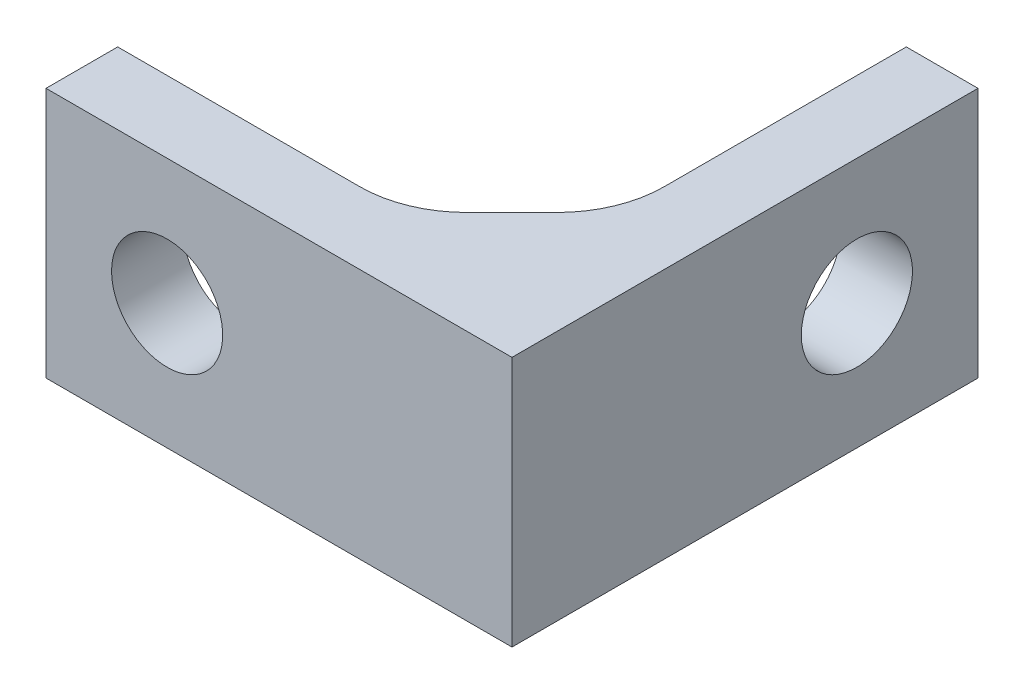
ISO-10303-21;
HEADER;
FILE_DESCRIPTION(('STEP AP214'),'2;1');
FILE_NAME('part.step','',(''),(''),'','','');
FILE_SCHEMA(('AUTOMOTIVE_DESIGN { 1 0 10303 214 1 1 1 1 }'));
ENDSEC;
DATA;
#1=APPLICATION_CONTEXT('core data for automotive mechanical design processes');
#2=APPLICATION_PROTOCOL_DEFINITION('international standard','automotive_design',2000,#1);
#3=PRODUCT_CONTEXT('',#1,'mechanical');
#4=PRODUCT('Part','Part','',(#3));
#5=PRODUCT_RELATED_PRODUCT_CATEGORY('part','',(#4));
#6=PRODUCT_DEFINITION_FORMATION('','',#4);
#7=PRODUCT_DEFINITION_CONTEXT('part definition',#1,'design');
#8=PRODUCT_DEFINITION('design','',#6,#7);
#9=PRODUCT_DEFINITION_SHAPE('','',#8);
#10=(LENGTH_UNIT() NAMED_UNIT(*) SI_UNIT(.MILLI.,.METRE.));
#11=(NAMED_UNIT(*) PLANE_ANGLE_UNIT() SI_UNIT($,.RADIAN.));
#12=(NAMED_UNIT(*) SI_UNIT($,.STERADIAN.) SOLID_ANGLE_UNIT());
#13=UNCERTAINTY_MEASURE_WITH_UNIT(LENGTH_MEASURE(1.E-05),#10,'distance_accuracy_value','');
#14=(GEOMETRIC_REPRESENTATION_CONTEXT(3) GLOBAL_UNCERTAINTY_ASSIGNED_CONTEXT((#13)) GLOBAL_UNIT_ASSIGNED_CONTEXT((#10,
#11,#12)) REPRESENTATION_CONTEXT('',''));
#15=CARTESIAN_POINT('',(0.,0.,0.));
#16=DIRECTION('',(0.,0.,1.));
#17=DIRECTION('',(1.,0.,0.));
#18=AXIS2_PLACEMENT_3D('',#15,#16,#17);
#19=CARTESIAN_POINT('',(0.,7.,-13.));
#20=DIRECTION('',(-1.,0.,0.));
#21=DIRECTION('',(0.,0.,1.));
#22=AXIS2_PLACEMENT_3D('',#19,#20,#21);
#23=PLANE('',#22);
#24=CARTESIAN_POINT('',(0.,3.5,-9.62132034355965));
#25=DIRECTION('',(-1.,0.,0.));
#26=DIRECTION('',(0.,0.,1.));
#27=AXIS2_PLACEMENT_3D('',#24,#25,#26);
#28=CIRCLE('',#27,1.55);
#29=CARTESIAN_POINT('',(0.,3.5,-8.07132034355965));
#30=VERTEX_POINT('',#29);
#31=EDGE_CURVE('E206',#30,#30,#28,.F.);
#32=ORIENTED_EDGE('',*,*,#31,.F.);
#33=EDGE_LOOP('',(#32));
#34=FACE_BOUND('',#33,.T.);
#35=DIRECTION('',(0.,0.,-1.));
#36=VECTOR('',#35,1.);
#37=CARTESIAN_POINT('',(0.,0.,-13.));
#38=LINE('',#37,#36);
#39=CARTESIAN_POINT('',(0.,0.,0.));
#40=VERTEX_POINT('',#39);
#41=CARTESIAN_POINT('',(0.,0.,-13.));
#42=VERTEX_POINT('',#41);
#43=EDGE_CURVE('E143',#40,#42,#38,.T.);
#44=ORIENTED_EDGE('',*,*,#43,.T.);
#45=DIRECTION('',(0.,-1.,0.));
#46=VECTOR('',#45,1.);
#47=CARTESIAN_POINT('',(0.,7.,-13.));
#48=LINE('',#47,#46);
#49=CARTESIAN_POINT('',(0.,7.,-13.));
#50=VERTEX_POINT('',#49);
#51=EDGE_CURVE('E11',#50,#42,#48,.T.);
#52=ORIENTED_EDGE('',*,*,#51,.F.);
#53=DIRECTION('',(0.,0.,-1.));
#54=VECTOR('',#53,1.);
#55=CARTESIAN_POINT('',(0.,7.,-13.));
#56=LINE('',#55,#54);
#57=CARTESIAN_POINT('',(0.,7.,0.));
#58=VERTEX_POINT('',#57);
#59=EDGE_CURVE('E160',#58,#50,#56,.T.);
#60=ORIENTED_EDGE('',*,*,#59,.F.);
#61=DIRECTION('',(0.,-1.,0.));
#62=VECTOR('',#61,1.);
#63=CARTESIAN_POINT('',(0.,7.,0.));
#64=LINE('',#63,#62);
#65=EDGE_CURVE('E139',#58,#40,#64,.T.);
#66=ORIENTED_EDGE('',*,*,#65,.T.);
#67=EDGE_LOOP('',(#44,#52,#60,#66));
#68=FACE_BOUND('',#67,.T.);
#69=ADVANCED_FACE('F41',(#34,#68),#23,.F.);
#70=CARTESIAN_POINT('',(-2.,7.,-13.));
#71=DIRECTION('',(0.,0.,1.));
#72=DIRECTION('',(1.,0.,0.));
#73=AXIS2_PLACEMENT_3D('',#70,#71,#72);
#74=PLANE('',#73);
#75=DIRECTION('',(-1.,0.,0.));
#76=VECTOR('',#75,1.);
#77=CARTESIAN_POINT('',(-2.,0.,-13.));
#78=LINE('',#77,#76);
#79=CARTESIAN_POINT('',(-2.,0.,-13.));
#80=VERTEX_POINT('',#79);
#81=EDGE_CURVE('E146',#42,#80,#78,.T.);
#82=ORIENTED_EDGE('',*,*,#81,.T.);
#83=DIRECTION('',(0.,-1.,0.));
#84=VECTOR('',#83,1.);
#85=CARTESIAN_POINT('',(-2.,7.,-13.));
#86=LINE('',#85,#84);
#87=CARTESIAN_POINT('',(-2.,7.,-13.));
#88=VERTEX_POINT('',#87);
#89=EDGE_CURVE('E49',#88,#80,#86,.T.);
#90=ORIENTED_EDGE('',*,*,#89,.F.);
#91=DIRECTION('',(-1.,0.,0.));
#92=VECTOR('',#91,1.);
#93=CARTESIAN_POINT('',(-2.,7.,-13.));
#94=LINE('',#93,#92);
#95=EDGE_CURVE('E103',#50,#88,#94,.T.);
#96=ORIENTED_EDGE('',*,*,#95,.F.);
#97=ORIENTED_EDGE('',*,*,#51,.T.);
#98=EDGE_LOOP('',(#82,#90,#96,#97));
#99=FACE_BOUND('',#98,.T.);
#100=ADVANCED_FACE('F217',(#99),#74,.F.);
#101=CARTESIAN_POINT('',(-2.,7.,-6.2426406871193));
#102=DIRECTION('',(1.,0.,0.));
#103=DIRECTION('',(0.,0.,-1.));
#104=AXIS2_PLACEMENT_3D('',#101,#102,#103);
#105=PLANE('',#104);
#106=CARTESIAN_POINT('',(-2.,3.5,-9.62132034355965));
#107=DIRECTION('',(-1.,0.,0.));
#108=DIRECTION('',(0.,0.,1.));
#109=AXIS2_PLACEMENT_3D('',#106,#107,#108);
#110=CIRCLE('',#109,1.55);
#111=CARTESIAN_POINT('',(-2.,3.5,-8.07132034355965));
#112=VERTEX_POINT('',#111);
#113=EDGE_CURVE('E209',#112,#112,#110,.T.);
#114=ORIENTED_EDGE('',*,*,#113,.F.);
#115=EDGE_LOOP('',(#114));
#116=FACE_BOUND('',#115,.T.);
#117=DIRECTION('',(0.,0.,1.));
#118=VECTOR('',#117,1.);
#119=CARTESIAN_POINT('',(-2.,0.,-6.2426406871193));
#120=LINE('',#119,#118);
#121=CARTESIAN_POINT('',(-2.,0.,-6.2426406871193));
#122=VERTEX_POINT('',#121);
#123=EDGE_CURVE('E149',#80,#122,#120,.T.);
#124=ORIENTED_EDGE('',*,*,#123,.T.);
#125=DIRECTION('',(0.,-1.,0.));
#126=VECTOR('',#125,1.);
#127=CARTESIAN_POINT('',(-2.,7.,-6.2426406871193));
#128=LINE('',#127,#126);
#129=CARTESIAN_POINT('',(-2.,7.,-6.2426406871193));
#130=VERTEX_POINT('',#129);
#131=EDGE_CURVE('E170',#130,#122,#128,.T.);
#132=ORIENTED_EDGE('',*,*,#131,.F.);
#133=DIRECTION('',(0.,0.,1.));
#134=VECTOR('',#133,1.);
#135=CARTESIAN_POINT('',(-2.,7.,-6.2426406871193));
#136=LINE('',#135,#134);
#137=EDGE_CURVE('E178',#88,#130,#136,.T.);
#138=ORIENTED_EDGE('',*,*,#137,.F.);
#139=ORIENTED_EDGE('',*,*,#89,.T.);
#140=EDGE_LOOP('',(#124,#132,#138,#139));
#141=FACE_BOUND('',#140,.T.);
#142=ADVANCED_FACE('F176',(#116,#141),#105,.F.);
#143=CARTESIAN_POINT('',(-5.,7.,-6.24264068711928));
#144=DIRECTION('',(0.,-1.,0.));
#145=DIRECTION('',(0.,0.,-1.));
#146=AXIS2_PLACEMENT_3D('',#143,#144,#145);
#147=CYLINDRICAL_SURFACE('',#146,3.);
#148=CARTESIAN_POINT('',(-5.,0.,-6.24264068711928));
#149=DIRECTION('',(0.,-1.,0.));
#150=DIRECTION('',(0.,0.,1.));
#151=AXIS2_PLACEMENT_3D('',#148,#149,#150);
#152=CIRCLE('',#151,3.);
#153=CARTESIAN_POINT('',(-2.87867965644037,0.,-4.12132034355963));
#154=VERTEX_POINT('',#153);
#155=EDGE_CURVE('E151',#122,#154,#152,.T.);
#156=ORIENTED_EDGE('',*,*,#155,.T.);
#157=DIRECTION('',(0.,-1.,0.));
#158=VECTOR('',#157,1.);
#159=CARTESIAN_POINT('',(-2.87867965644037,7.,-4.12132034355963));
#160=LINE('',#159,#158);
#161=CARTESIAN_POINT('',(-2.87867965644037,7.,-4.12132034355963));
#162=VERTEX_POINT('',#161);
#163=EDGE_CURVE('E167',#162,#154,#160,.T.);
#164=ORIENTED_EDGE('',*,*,#163,.F.);
#165=CARTESIAN_POINT('',(-5.,7.,-6.24264068711928));
#166=DIRECTION('',(0.,-1.,0.));
#167=DIRECTION('',(0.,0.,1.));
#168=AXIS2_PLACEMENT_3D('',#165,#166,#167);
#169=CIRCLE('',#168,3.);
#170=EDGE_CURVE('E194',#130,#162,#169,.T.);
#171=ORIENTED_EDGE('',*,*,#170,.F.);
#172=ORIENTED_EDGE('',*,*,#131,.T.);
#173=EDGE_LOOP('',(#156,#164,#171,#172));
#174=FACE_BOUND('',#173,.T.);
#175=ADVANCED_FACE('F187',(#174),#147,.F.);
#176=CARTESIAN_POINT('',(-2.87867965644037,7.,-4.12132034355963));
#177=DIRECTION('',(0.707106781186547,0.,0.707106781186547));
#178=DIRECTION('',(0.707106781186548,0.,-0.707106781186548));
#179=AXIS2_PLACEMENT_3D('',#176,#177,#178);
#180=PLANE('',#179);
#181=DIRECTION('',(-0.707106781186548,0.,0.707106781186548));
#182=VECTOR('',#181,1.);
#183=CARTESIAN_POINT('',(-2.87867965644037,0.,-4.12132034355963));
#184=LINE('',#183,#182);
#185=CARTESIAN_POINT('',(-4.12132034355963,0.,-2.87867965644037));
#186=VERTEX_POINT('',#185);
#187=EDGE_CURVE('E153',#154,#186,#184,.T.);
#188=ORIENTED_EDGE('',*,*,#187,.T.);
#189=DIRECTION('',(0.,-1.,0.));
#190=VECTOR('',#189,1.);
#191=CARTESIAN_POINT('',(-4.12132034355963,7.,-2.87867965644037));
#192=LINE('',#191,#190);
#193=CARTESIAN_POINT('',(-4.12132034355963,7.,-2.87867965644037));
#194=VERTEX_POINT('',#193);
#195=EDGE_CURVE('E164',#194,#186,#192,.T.);
#196=ORIENTED_EDGE('',*,*,#195,.F.);
#197=DIRECTION('',(-0.707106781186548,0.,0.707106781186548));
#198=VECTOR('',#197,1.);
#199=CARTESIAN_POINT('',(-2.87867965644037,7.,-4.12132034355963));
#200=LINE('',#199,#198);
#201=EDGE_CURVE('E193',#162,#194,#200,.T.);
#202=ORIENTED_EDGE('',*,*,#201,.F.);
#203=ORIENTED_EDGE('',*,*,#163,.T.);
#204=EDGE_LOOP('',(#188,#196,#202,#203));
#205=FACE_BOUND('',#204,.T.);
#206=ADVANCED_FACE('F191',(#205),#180,.F.);
#207=CARTESIAN_POINT('',(-6.24264068711928,7.,-5.));
#208=DIRECTION('',(0.,-1.,0.));
#209=DIRECTION('',(0.,0.,-1.));
#210=AXIS2_PLACEMENT_3D('',#207,#208,#209);
#211=CYLINDRICAL_SURFACE('',#210,3.);
#212=CARTESIAN_POINT('',(-6.24264068711928,0.,-5.));
#213=DIRECTION('',(0.,-1.,0.));
#214=DIRECTION('',(0.,0.,-1.));
#215=AXIS2_PLACEMENT_3D('',#212,#213,#214);
#216=CIRCLE('',#215,3.);
#217=CARTESIAN_POINT('',(-6.2426406871193,0.,-2.));
#218=VERTEX_POINT('',#217);
#219=EDGE_CURVE('E155',#186,#218,#216,.T.);
#220=ORIENTED_EDGE('',*,*,#219,.T.);
#221=DIRECTION('',(0.,-1.,0.));
#222=VECTOR('',#221,1.);
#223=CARTESIAN_POINT('',(-6.2426406871193,7.,-2.));
#224=LINE('',#223,#222);
#225=CARTESIAN_POINT('',(-6.2426406871193,7.,-2.));
#226=VERTEX_POINT('',#225);
#227=EDGE_CURVE('E134',#226,#218,#224,.T.);
#228=ORIENTED_EDGE('',*,*,#227,.F.);
#229=CARTESIAN_POINT('',(-6.24264068711928,7.,-5.));
#230=DIRECTION('',(0.,-1.,0.));
#231=DIRECTION('',(0.,0.,-1.));
#232=AXIS2_PLACEMENT_3D('',#229,#230,#231);
#233=CIRCLE('',#232,3.);
#234=EDGE_CURVE('E125',#194,#226,#233,.T.);
#235=ORIENTED_EDGE('',*,*,#234,.F.);
#236=ORIENTED_EDGE('',*,*,#195,.T.);
#237=EDGE_LOOP('',(#220,#228,#235,#236));
#238=FACE_BOUND('',#237,.T.);
#239=ADVANCED_FACE('F235',(#238),#211,.F.);
#240=CARTESIAN_POINT('',(-13.,7.,-2.));
#241=DIRECTION('',(0.,0.,1.));
#242=DIRECTION('',(1.,0.,0.));
#243=AXIS2_PLACEMENT_3D('',#240,#241,#242);
#244=PLANE('',#243);
#245=CARTESIAN_POINT('',(-9.62132034355965,3.5,-2.));
#246=DIRECTION('',(0.,0.,-1.));
#247=DIRECTION('',(-1.,0.,0.));
#248=AXIS2_PLACEMENT_3D('',#245,#246,#247);
#249=CIRCLE('',#248,1.55);
#250=CARTESIAN_POINT('',(-11.1713203435596,3.5,-2.));
#251=VERTEX_POINT('',#250);
#252=EDGE_CURVE('E203',#251,#251,#249,.T.);
#253=ORIENTED_EDGE('',*,*,#252,.F.);
#254=EDGE_LOOP('',(#253));
#255=FACE_BOUND('',#254,.T.);
#256=DIRECTION('',(-1.,0.,0.));
#257=VECTOR('',#256,1.);
#258=CARTESIAN_POINT('',(-13.,0.,-2.));
#259=LINE('',#258,#257);
#260=CARTESIAN_POINT('',(-13.,0.,-2.));
#261=VERTEX_POINT('',#260);
#262=EDGE_CURVE('E133',#218,#261,#259,.T.);
#263=ORIENTED_EDGE('',*,*,#262,.T.);
#264=DIRECTION('',(0.,-1.,0.));
#265=VECTOR('',#264,1.);
#266=CARTESIAN_POINT('',(-13.,7.,-2.));
#267=LINE('',#266,#265);
#268=CARTESIAN_POINT('',(-13.,7.,-2.));
#269=VERTEX_POINT('',#268);
#270=EDGE_CURVE('E130',#269,#261,#267,.T.);
#271=ORIENTED_EDGE('',*,*,#270,.F.);
#272=DIRECTION('',(-1.,0.,0.));
#273=VECTOR('',#272,1.);
#274=CARTESIAN_POINT('',(-13.,7.,-2.));
#275=LINE('',#274,#273);
#276=EDGE_CURVE('E119',#226,#269,#275,.T.);
#277=ORIENTED_EDGE('',*,*,#276,.F.);
#278=ORIENTED_EDGE('',*,*,#227,.T.);
#279=EDGE_LOOP('',(#263,#271,#277,#278));
#280=FACE_BOUND('',#279,.T.);
#281=ADVANCED_FACE('F131',(#255,#280),#244,.F.);
#282=CARTESIAN_POINT('',(-13.,7.,0.));
#283=DIRECTION('',(1.,0.,0.));
#284=DIRECTION('',(0.,0.,-1.));
#285=AXIS2_PLACEMENT_3D('',#282,#283,#284);
#286=PLANE('',#285);
#287=DIRECTION('',(0.,0.,1.));
#288=VECTOR('',#287,1.);
#289=CARTESIAN_POINT('',(-13.,0.,0.));
#290=LINE('',#289,#288);
#291=CARTESIAN_POINT('',(-13.,0.,0.));
#292=VERTEX_POINT('',#291);
#293=EDGE_CURVE('E89',#261,#292,#290,.T.);
#294=ORIENTED_EDGE('',*,*,#293,.T.);
#295=DIRECTION('',(0.,-1.,0.));
#296=VECTOR('',#295,1.);
#297=CARTESIAN_POINT('',(-13.,7.,0.));
#298=LINE('',#297,#296);
#299=CARTESIAN_POINT('',(-13.,7.,0.));
#300=VERTEX_POINT('',#299);
#301=EDGE_CURVE('E135',#300,#292,#298,.T.);
#302=ORIENTED_EDGE('',*,*,#301,.F.);
#303=DIRECTION('',(0.,0.,1.));
#304=VECTOR('',#303,1.);
#305=CARTESIAN_POINT('',(-13.,7.,0.));
#306=LINE('',#305,#304);
#307=EDGE_CURVE('E123',#269,#300,#306,.T.);
#308=ORIENTED_EDGE('',*,*,#307,.F.);
#309=ORIENTED_EDGE('',*,*,#270,.T.);
#310=EDGE_LOOP('',(#294,#302,#308,#309));
#311=FACE_BOUND('',#310,.T.);
#312=ADVANCED_FACE('F137',(#311),#286,.F.);
#313=CARTESIAN_POINT('',(0.,7.,0.));
#314=DIRECTION('',(0.,0.,-1.));
#315=DIRECTION('',(-1.,0.,0.));
#316=AXIS2_PLACEMENT_3D('',#313,#314,#315);
#317=PLANE('',#316);
#318=CARTESIAN_POINT('',(-9.62132034355965,3.5,0.));
#319=DIRECTION('',(0.,0.,-1.));
#320=DIRECTION('',(-1.,0.,0.));
#321=AXIS2_PLACEMENT_3D('',#318,#319,#320);
#322=CIRCLE('',#321,1.55);
#323=CARTESIAN_POINT('',(-11.1713203435596,3.5,0.));
#324=VERTEX_POINT('',#323);
#325=EDGE_CURVE('E147',#324,#324,#322,.F.);
#326=ORIENTED_EDGE('',*,*,#325,.F.);
#327=EDGE_LOOP('',(#326));
#328=FACE_BOUND('',#327,.T.);
#329=DIRECTION('',(1.,0.,0.));
#330=VECTOR('',#329,1.);
#331=CARTESIAN_POINT('',(0.,0.,0.));
#332=LINE('',#331,#330);
#333=EDGE_CURVE('E95',#292,#40,#332,.T.);
#334=ORIENTED_EDGE('',*,*,#333,.T.);
#335=ORIENTED_EDGE('',*,*,#65,.F.);
#336=DIRECTION('',(1.,0.,0.));
#337=VECTOR('',#336,1.);
#338=CARTESIAN_POINT('',(0.,7.,0.));
#339=LINE('',#338,#337);
#340=EDGE_CURVE('E57',#300,#58,#339,.T.);
#341=ORIENTED_EDGE('',*,*,#340,.F.);
#342=ORIENTED_EDGE('',*,*,#301,.T.);
#343=EDGE_LOOP('',(#334,#335,#341,#342));
#344=FACE_BOUND('',#343,.T.);
#345=ADVANCED_FACE('F248',(#328,#344),#317,.F.);
#346=CARTESIAN_POINT('',(-6.24264068711928,7.,-5.));
#347=DIRECTION('',(0.,-1.,0.));
#348=DIRECTION('',(0.,0.,-1.));
#349=AXIS2_PLACEMENT_3D('',#346,#347,#348);
#350=PLANE('',#349);
#351=ORIENTED_EDGE('',*,*,#59,.T.);
#352=ORIENTED_EDGE('',*,*,#95,.T.);
#353=ORIENTED_EDGE('',*,*,#137,.T.);
#354=ORIENTED_EDGE('',*,*,#170,.T.);
#355=ORIENTED_EDGE('',*,*,#201,.T.);
#356=ORIENTED_EDGE('',*,*,#234,.T.);
#357=ORIENTED_EDGE('',*,*,#276,.T.);
#358=ORIENTED_EDGE('',*,*,#307,.T.);
#359=ORIENTED_EDGE('',*,*,#340,.T.);
#360=EDGE_LOOP('',(#351,#352,#353,#354,#355,#356,#357,#358,#359));
#361=FACE_BOUND('',#360,.T.);
#362=ADVANCED_FACE('F121',(#361),#350,.F.);
#363=CARTESIAN_POINT('',(-6.24264068711928,0.,-5.));
#364=DIRECTION('',(0.,-1.,0.));
#365=DIRECTION('',(0.,0.,-1.));
#366=AXIS2_PLACEMENT_3D('',#363,#364,#365);
#367=PLANE('',#366);
#368=ORIENTED_EDGE('',*,*,#43,.F.);
#369=ORIENTED_EDGE('',*,*,#333,.F.);
#370=ORIENTED_EDGE('',*,*,#293,.F.);
#371=ORIENTED_EDGE('',*,*,#262,.F.);
#372=ORIENTED_EDGE('',*,*,#219,.F.);
#373=ORIENTED_EDGE('',*,*,#187,.F.);
#374=ORIENTED_EDGE('',*,*,#155,.F.);
#375=ORIENTED_EDGE('',*,*,#123,.F.);
#376=ORIENTED_EDGE('',*,*,#81,.F.);
#377=EDGE_LOOP('',(#368,#369,#370,#371,#372,#373,#374,#375,#376));
#378=FACE_BOUND('',#377,.T.);
#379=ADVANCED_FACE('F182',(#378),#367,.T.);
#380=CARTESIAN_POINT('',(-9.62132034355965,3.5,0.00100000000000013));
#381=DIRECTION('',(0.,0.,-1.));
#382=DIRECTION('',(-1.,0.,0.));
#383=AXIS2_PLACEMENT_3D('',#380,#381,#382);
#384=CYLINDRICAL_SURFACE('',#383,1.55);
#385=ORIENTED_EDGE('',*,*,#252,.T.);
#386=EDGE_LOOP('',(#385));
#387=FACE_BOUND('',#386,.T.);
#388=ORIENTED_EDGE('',*,*,#325,.T.);
#389=EDGE_LOOP('',(#388));
#390=FACE_BOUND('',#389,.T.);
#391=ADVANCED_FACE('F254',(#387,#390),#384,.F.);
#392=CARTESIAN_POINT('',(0.00100000000000013,3.5,-9.62132034355965));
#393=DIRECTION('',(-1.,0.,0.));
#394=DIRECTION('',(0.,0.,1.));
#395=AXIS2_PLACEMENT_3D('',#392,#393,#394);
#396=CYLINDRICAL_SURFACE('',#395,1.55);
#397=ORIENTED_EDGE('',*,*,#113,.T.);
#398=EDGE_LOOP('',(#397));
#399=FACE_BOUND('',#398,.T.);
#400=ORIENTED_EDGE('',*,*,#31,.T.);
#401=EDGE_LOOP('',(#400));
#402=FACE_BOUND('',#401,.T.);
#403=ADVANCED_FACE('F213',(#399,#402),#396,.F.);
#404=CLOSED_SHELL('',(#69,#100,#142,#175,#206,#239,#281,#312,#345,#362,#379,#391,#403));
#405=MANIFOLD_SOLID_BREP('B2',#404);
#406=ADVANCED_BREP_SHAPE_REPRESENTATION('',(#18,#405),#14);
#407=SHAPE_DEFINITION_REPRESENTATION(#9,#406);
ENDSEC;
END-ISO-10303-21;
